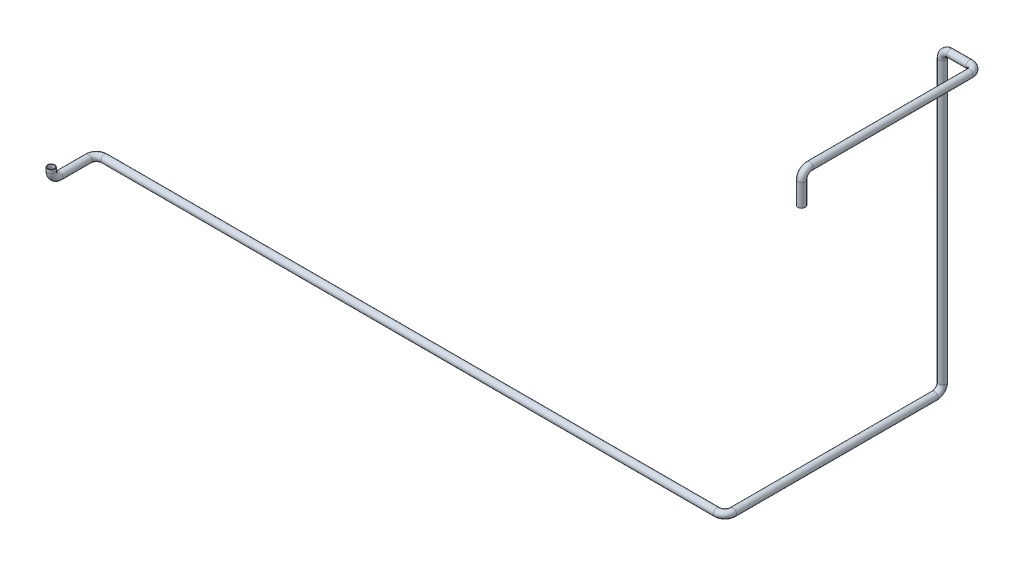
ISO-10303-21;
HEADER;
FILE_DESCRIPTION(('STEP AP214'),'2;1');
FILE_NAME('part.step','',(''),(''),'','','');
FILE_SCHEMA(('AUTOMOTIVE_DESIGN { 1 0 10303 214 1 1 1 1 }'));
ENDSEC;
DATA;
#1=APPLICATION_CONTEXT('core data for automotive mechanical design processes');
#2=APPLICATION_PROTOCOL_DEFINITION('international standard','automotive_design',2000,#1);
#3=PRODUCT_CONTEXT('',#1,'mechanical');
#4=PRODUCT('Part','Part','',(#3));
#5=PRODUCT_RELATED_PRODUCT_CATEGORY('part','',(#4));
#6=PRODUCT_DEFINITION_FORMATION('','',#4);
#7=PRODUCT_DEFINITION_CONTEXT('part definition',#1,'design');
#8=PRODUCT_DEFINITION('design','',#6,#7);
#9=PRODUCT_DEFINITION_SHAPE('','',#8);
#10=(LENGTH_UNIT() NAMED_UNIT(*) SI_UNIT(.MILLI.,.METRE.));
#11=(NAMED_UNIT(*) PLANE_ANGLE_UNIT() SI_UNIT($,.RADIAN.));
#12=(NAMED_UNIT(*) SI_UNIT($,.STERADIAN.) SOLID_ANGLE_UNIT());
#13=UNCERTAINTY_MEASURE_WITH_UNIT(LENGTH_MEASURE(1.E-05),#10,'distance_accuracy_value','');
#14=(GEOMETRIC_REPRESENTATION_CONTEXT(3) GLOBAL_UNCERTAINTY_ASSIGNED_CONTEXT((#13)) GLOBAL_UNIT_ASSIGNED_CONTEXT((#10,
#11,#12)) REPRESENTATION_CONTEXT('',''));
#15=CARTESIAN_POINT('',(0.,0.,0.));
#16=DIRECTION('',(0.,0.,1.));
#17=DIRECTION('',(1.,0.,0.));
#18=AXIS2_PLACEMENT_3D('',#15,#16,#17);
#19=CARTESIAN_POINT('',(0.,-5.,0.));
#20=DIRECTION('',(0.,1.,0.));
#21=DIRECTION('',(0.,0.,1.));
#22=AXIS2_PLACEMENT_3D('',#19,#20,#21);
#23=CYLINDRICAL_SURFACE('',#22,14.5);
#24=CARTESIAN_POINT('',(0.,0.,0.));
#25=DIRECTION('',(0.,1.,0.));
#26=DIRECTION('',(0.,0.,1.));
#27=AXIS2_PLACEMENT_3D('',#24,#25,#26);
#28=CIRCLE('',#27,14.5);
#29=CARTESIAN_POINT('',(0.,0.,14.5));
#30=VERTEX_POINT('',#29);
#31=EDGE_CURVE('E10',#30,#30,#28,.T.);
#32=ORIENTED_EDGE('',*,*,#31,.F.);
#33=EDGE_LOOP('',(#32));
#34=FACE_BOUND('',#33,.T.);
#35=CARTESIAN_POINT('',(0.,-13.,0.));
#36=DIRECTION('',(0.,-1.,0.));
#37=DIRECTION('',(0.,0.,-1.));
#38=AXIS2_PLACEMENT_3D('',#35,#36,#37);
#39=CIRCLE('',#38,14.5);
#40=CARTESIAN_POINT('',(0.,-13.,14.5));
#41=VERTEX_POINT('',#40);
#42=EDGE_CURVE('E130',#41,#41,#39,.T.);
#43=ORIENTED_EDGE('',*,*,#42,.F.);
#44=EDGE_LOOP('',(#43));
#45=FACE_BOUND('',#44,.T.);
#46=ADVANCED_FACE('F33',(#34,#45),#23,.T.);
#47=CARTESIAN_POINT('',(0.,0.,0.));
#48=DIRECTION('',(0.,1.,0.));
#49=DIRECTION('',(0.,0.,1.));
#50=AXIS2_PLACEMENT_3D('',#47,#48,#49);
#51=PLANE('',#50);
#52=CARTESIAN_POINT('',(0.,0.,0.));
#53=DIRECTION('',(0.,1.,0.));
#54=DIRECTION('',(0.,0.,1.));
#55=AXIS2_PLACEMENT_3D('',#52,#53,#54);
#56=CIRCLE('',#55,12.7);
#57=CARTESIAN_POINT('',(0.,0.,12.7));
#58=VERTEX_POINT('',#57);
#59=EDGE_CURVE('E39',#58,#58,#56,.T.);
#60=ORIENTED_EDGE('',*,*,#59,.F.);
#61=EDGE_LOOP('',(#60));
#62=FACE_BOUND('',#61,.T.);
#63=ORIENTED_EDGE('',*,*,#31,.T.);
#64=EDGE_LOOP('',(#63));
#65=FACE_BOUND('',#64,.T.);
#66=ADVANCED_FACE('F249',(#62,#65),#51,.T.);
#67=CARTESIAN_POINT('',(0.,-5.,0.));
#68=DIRECTION('',(0.,1.,0.));
#69=DIRECTION('',(0.,0.,1.));
#70=AXIS2_PLACEMENT_3D('',#67,#68,#69);
#71=CYLINDRICAL_SURFACE('',#70,12.7);
#72=ORIENTED_EDGE('',*,*,#59,.T.);
#73=EDGE_LOOP('',(#72));
#74=FACE_BOUND('',#73,.T.);
#75=CARTESIAN_POINT('',(0.,-13.,0.));
#76=DIRECTION('',(0.,-1.,0.));
#77=DIRECTION('',(0.,0.,-1.));
#78=AXIS2_PLACEMENT_3D('',#75,#76,#77);
#79=CIRCLE('',#78,12.7);
#80=CARTESIAN_POINT('',(0.,-13.,12.7));
#81=VERTEX_POINT('',#80);
#82=EDGE_CURVE('E133',#81,#81,#79,.T.);
#83=ORIENTED_EDGE('',*,*,#82,.T.);
#84=EDGE_LOOP('',(#83));
#85=FACE_BOUND('',#84,.T.);
#86=ADVANCED_FACE('F137',(#74,#85),#71,.F.);
#87=CARTESIAN_POINT('',(2640.,1103.,-345.));
#88=DIRECTION('',(0.,-1.,0.));
#89=DIRECTION('',(0.,0.,-1.));
#90=AXIS2_PLACEMENT_3D('',#87,#88,#89);
#91=CYLINDRICAL_SURFACE('',#90,14.5);
#92=CARTESIAN_POINT('',(2640.,1103.,-345.));
#93=DIRECTION('',(0.,-1.,0.));
#94=DIRECTION('',(-1.,0.,0.));
#95=AXIS2_PLACEMENT_3D('',#92,#93,#94);
#96=CIRCLE('',#95,14.5);
#97=CARTESIAN_POINT('',(2640.,1103.,-330.5));
#98=VERTEX_POINT('',#97);
#99=EDGE_CURVE('E52',#98,#98,#96,.T.);
#100=ORIENTED_EDGE('',*,*,#99,.T.);
#101=EDGE_LOOP('',(#100));
#102=FACE_BOUND('',#101,.T.);
#103=CARTESIAN_POINT('',(2640.,1015.,-345.));
#104=DIRECTION('',(0.,-1.,0.));
#105=DIRECTION('',(-1.,0.,0.));
#106=AXIS2_PLACEMENT_3D('',#103,#104,#105);
#107=CIRCLE('',#106,14.5);
#108=CARTESIAN_POINT('',(2625.5,1015.,-345.));
#109=VERTEX_POINT('',#108);
#110=EDGE_CURVE('E43',#109,#109,#107,.T.);
#111=ORIENTED_EDGE('',*,*,#110,.F.);
#112=EDGE_LOOP('',(#111));
#113=FACE_BOUND('',#112,.T.);
#114=ADVANCED_FACE('F234',(#102,#113),#91,.T.);
#115=CARTESIAN_POINT('',(2640.,1103.,-345.));
#116=DIRECTION('',(0.,-1.,0.));
#117=DIRECTION('',(0.,0.,-1.));
#118=AXIS2_PLACEMENT_3D('',#115,#116,#117);
#119=CYLINDRICAL_SURFACE('',#118,12.7);
#120=CARTESIAN_POINT('',(2640.,1103.,-345.));
#121=DIRECTION('',(0.,-1.,0.));
#122=DIRECTION('',(-1.,0.,0.));
#123=AXIS2_PLACEMENT_3D('',#120,#121,#122);
#124=CIRCLE('',#123,12.7);
#125=CARTESIAN_POINT('',(2640.,1103.,-332.3));
#126=VERTEX_POINT('',#125);
#127=EDGE_CURVE('E55',#126,#126,#124,.T.);
#128=ORIENTED_EDGE('',*,*,#127,.F.);
#129=EDGE_LOOP('',(#128));
#130=FACE_BOUND('',#129,.T.);
#131=CARTESIAN_POINT('',(2640.,1015.,-345.));
#132=DIRECTION('',(0.,-1.,0.));
#133=DIRECTION('',(-1.,0.,0.));
#134=AXIS2_PLACEMENT_3D('',#131,#132,#133);
#135=CIRCLE('',#134,12.7);
#136=CARTESIAN_POINT('',(2627.3,1015.,-345.));
#137=VERTEX_POINT('',#136);
#138=EDGE_CURVE('E47',#137,#137,#135,.T.);
#139=ORIENTED_EDGE('',*,*,#138,.T.);
#140=EDGE_LOOP('',(#139));
#141=FACE_BOUND('',#140,.T.);
#142=ADVANCED_FACE('F231',(#130,#141),#119,.F.);
#143=CARTESIAN_POINT('',(2640.,1103.,-377.));
#144=DIRECTION('',(1.,0.,0.));
#145=DIRECTION('',(0.,0.,-1.));
#146=AXIS2_PLACEMENT_3D('',#143,#144,#145);
#147=TOROIDAL_SURFACE('',#146,31.9999999999998,14.5);
#148=CARTESIAN_POINT('',(2640.,1135.,-377.));
#149=DIRECTION('',(0.,0.,1.));
#150=DIRECTION('',(-1.,0.,0.));
#151=AXIS2_PLACEMENT_3D('',#148,#149,#150);
#152=CIRCLE('',#151,14.5);
#153=CARTESIAN_POINT('',(2640.,1149.5,-377.));
#154=VERTEX_POINT('',#153);
#155=EDGE_CURVE('E58',#154,#154,#152,.T.);
#156=CARTESIAN_POINT('',(2640.,1103.,-377.));
#157=DIRECTION('',(1.,0.,0.));
#158=DIRECTION('',(0.,0.,-1.));
#159=AXIS2_PLACEMENT_3D('',#156,#157,#158);
#160=CIRCLE('',#159,46.4999999999998);
#161=EDGE_CURVE('',#154,#98,#160,.T.);
#162=ORIENTED_EDGE('',*,*,#155,.T.);
#163=ORIENTED_EDGE('',*,*,#99,.F.);
#164=ORIENTED_EDGE('',*,*,#161,.T.);
#165=ORIENTED_EDGE('',*,*,#161,.F.);
#166=EDGE_LOOP('',(#162,#164,#163,#165));
#167=FACE_BOUND('',#166,.T.);
#168=ADVANCED_FACE('F227',(#167),#147,.T.);
#169=CARTESIAN_POINT('',(2640.,1103.,-377.));
#170=DIRECTION('',(1.,0.,0.));
#171=DIRECTION('',(0.,0.,-1.));
#172=AXIS2_PLACEMENT_3D('',#169,#170,#171);
#173=TOROIDAL_SURFACE('',#172,31.9999999999998,12.7);
#174=CARTESIAN_POINT('',(2640.,1135.,-377.));
#175=DIRECTION('',(0.,0.,1.));
#176=DIRECTION('',(-1.,0.,0.));
#177=AXIS2_PLACEMENT_3D('',#174,#175,#176);
#178=CIRCLE('',#177,12.7);
#179=CARTESIAN_POINT('',(2640.,1147.7,-377.));
#180=VERTEX_POINT('',#179);
#181=EDGE_CURVE('E61',#180,#180,#178,.T.);
#182=CARTESIAN_POINT('',(2640.,1103.,-377.));
#183=DIRECTION('',(1.,0.,0.));
#184=DIRECTION('',(0.,0.,-1.));
#185=AXIS2_PLACEMENT_3D('',#182,#183,#184);
#186=CIRCLE('',#185,44.6999999999998);
#187=EDGE_CURVE('',#180,#126,#186,.T.);
#188=ORIENTED_EDGE('',*,*,#181,.F.);
#189=ORIENTED_EDGE('',*,*,#127,.T.);
#190=ORIENTED_EDGE('',*,*,#187,.T.);
#191=ORIENTED_EDGE('',*,*,#187,.F.);
#192=EDGE_LOOP('',(#188,#190,#189,#191));
#193=FACE_BOUND('',#192,.T.);
#194=ADVANCED_FACE('F224',(#193),#173,.F.);
#195=CARTESIAN_POINT('',(2640.,1135.,-1013.));
#196=DIRECTION('',(0.,0.,1.));
#197=DIRECTION('',(1.,0.,0.));
#198=AXIS2_PLACEMENT_3D('',#195,#196,#197);
#199=CYLINDRICAL_SURFACE('',#198,14.5);
#200=CARTESIAN_POINT('',(2640.,1135.,-1013.));
#201=DIRECTION('',(0.,0.,1.));
#202=DIRECTION('',(-1.,0.,0.));
#203=AXIS2_PLACEMENT_3D('',#200,#201,#202);
#204=CIRCLE('',#203,14.5);
#205=CARTESIAN_POINT('',(2654.5,1135.,-1013.));
#206=VERTEX_POINT('',#205);
#207=EDGE_CURVE('E64',#206,#206,#204,.T.);
#208=ORIENTED_EDGE('',*,*,#207,.T.);
#209=EDGE_LOOP('',(#208));
#210=FACE_BOUND('',#209,.T.);
#211=ORIENTED_EDGE('',*,*,#155,.F.);
#212=EDGE_LOOP('',(#211));
#213=FACE_BOUND('',#212,.T.);
#214=ADVANCED_FACE('F220',(#210,#213),#199,.T.);
#215=CARTESIAN_POINT('',(2640.,1135.,-1013.));
#216=DIRECTION('',(0.,0.,1.));
#217=DIRECTION('',(1.,0.,0.));
#218=AXIS2_PLACEMENT_3D('',#215,#216,#217);
#219=CYLINDRICAL_SURFACE('',#218,12.7);
#220=CARTESIAN_POINT('',(2640.,1135.,-1013.));
#221=DIRECTION('',(0.,0.,1.));
#222=DIRECTION('',(-1.,0.,0.));
#223=AXIS2_PLACEMENT_3D('',#220,#221,#222);
#224=CIRCLE('',#223,12.7);
#225=CARTESIAN_POINT('',(2652.7,1135.,-1013.));
#226=VERTEX_POINT('',#225);
#227=EDGE_CURVE('E67',#226,#226,#224,.T.);
#228=ORIENTED_EDGE('',*,*,#227,.F.);
#229=EDGE_LOOP('',(#228));
#230=FACE_BOUND('',#229,.T.);
#231=ORIENTED_EDGE('',*,*,#181,.T.);
#232=EDGE_LOOP('',(#231));
#233=FACE_BOUND('',#232,.T.);
#234=ADVANCED_FACE('F217',(#230,#233),#219,.F.);
#235=CARTESIAN_POINT('',(2608.,1135.,-1013.));
#236=DIRECTION('',(0.,-1.,0.));
#237=DIRECTION('',(0.,0.,-1.));
#238=AXIS2_PLACEMENT_3D('',#235,#236,#237);
#239=TOROIDAL_SURFACE('',#238,31.9999999999998,14.5);
#240=CARTESIAN_POINT('',(2608.,1135.,-1045.));
#241=DIRECTION('',(1.,0.,0.));
#242=DIRECTION('',(0.,0.,1.));
#243=AXIS2_PLACEMENT_3D('',#240,#241,#242);
#244=CIRCLE('',#243,14.5);
#245=CARTESIAN_POINT('',(2608.,1135.,-1059.5));
#246=VERTEX_POINT('',#245);
#247=EDGE_CURVE('E70',#246,#246,#244,.T.);
#248=CARTESIAN_POINT('',(2608.,1135.,-1013.));
#249=DIRECTION('',(0.,-1.,0.));
#250=DIRECTION('',(0.,0.,-1.));
#251=AXIS2_PLACEMENT_3D('',#248,#249,#250);
#252=CIRCLE('',#251,46.4999999999998);
#253=EDGE_CURVE('',#246,#206,#252,.T.);
#254=ORIENTED_EDGE('',*,*,#247,.T.);
#255=ORIENTED_EDGE('',*,*,#207,.F.);
#256=ORIENTED_EDGE('',*,*,#253,.T.);
#257=ORIENTED_EDGE('',*,*,#253,.F.);
#258=EDGE_LOOP('',(#254,#256,#255,#257));
#259=FACE_BOUND('',#258,.T.);
#260=ADVANCED_FACE('F213',(#259),#239,.T.);
#261=CARTESIAN_POINT('',(2608.,1135.,-1013.));
#262=DIRECTION('',(0.,-1.,0.));
#263=DIRECTION('',(0.,0.,-1.));
#264=AXIS2_PLACEMENT_3D('',#261,#262,#263);
#265=TOROIDAL_SURFACE('',#264,31.9999999999998,12.7);
#266=CARTESIAN_POINT('',(2608.,1135.,-1045.));
#267=DIRECTION('',(1.,0.,0.));
#268=DIRECTION('',(0.,0.,1.));
#269=AXIS2_PLACEMENT_3D('',#266,#267,#268);
#270=CIRCLE('',#269,12.7);
#271=CARTESIAN_POINT('',(2608.,1135.,-1057.7));
#272=VERTEX_POINT('',#271);
#273=EDGE_CURVE('E73',#272,#272,#270,.T.);
#274=CARTESIAN_POINT('',(2608.,1135.,-1013.));
#275=DIRECTION('',(0.,-1.,0.));
#276=DIRECTION('',(0.,0.,-1.));
#277=AXIS2_PLACEMENT_3D('',#274,#275,#276);
#278=CIRCLE('',#277,44.6999999999998);
#279=EDGE_CURVE('',#272,#226,#278,.T.);
#280=ORIENTED_EDGE('',*,*,#273,.F.);
#281=ORIENTED_EDGE('',*,*,#227,.T.);
#282=ORIENTED_EDGE('',*,*,#279,.T.);
#283=ORIENTED_EDGE('',*,*,#279,.F.);
#284=EDGE_LOOP('',(#280,#282,#281,#283));
#285=FACE_BOUND('',#284,.T.);
#286=ADVANCED_FACE('F210',(#285),#265,.F.);
#287=CARTESIAN_POINT('',(2532.,1135.,-1045.));
#288=DIRECTION('',(1.,0.,0.));
#289=DIRECTION('',(0.,0.,-1.));
#290=AXIS2_PLACEMENT_3D('',#287,#288,#289);
#291=CYLINDRICAL_SURFACE('',#290,14.5);
#292=CARTESIAN_POINT('',(2532.,1135.,-1045.));
#293=DIRECTION('',(1.,0.,0.));
#294=DIRECTION('',(0.,0.,1.));
#295=AXIS2_PLACEMENT_3D('',#292,#293,#294);
#296=CIRCLE('',#295,14.5);
#297=CARTESIAN_POINT('',(2532.,1149.5,-1045.));
#298=VERTEX_POINT('',#297);
#299=EDGE_CURVE('E76',#298,#298,#296,.T.);
#300=ORIENTED_EDGE('',*,*,#299,.T.);
#301=EDGE_LOOP('',(#300));
#302=FACE_BOUND('',#301,.T.);
#303=ORIENTED_EDGE('',*,*,#247,.F.);
#304=EDGE_LOOP('',(#303));
#305=FACE_BOUND('',#304,.T.);
#306=ADVANCED_FACE('F206',(#302,#305),#291,.T.);
#307=CARTESIAN_POINT('',(2532.,1135.,-1045.));
#308=DIRECTION('',(1.,0.,0.));
#309=DIRECTION('',(0.,0.,-1.));
#310=AXIS2_PLACEMENT_3D('',#307,#308,#309);
#311=CYLINDRICAL_SURFACE('',#310,12.7);
#312=CARTESIAN_POINT('',(2532.,1135.,-1045.));
#313=DIRECTION('',(1.,0.,0.));
#314=DIRECTION('',(0.,0.,1.));
#315=AXIS2_PLACEMENT_3D('',#312,#313,#314);
#316=CIRCLE('',#315,12.7);
#317=CARTESIAN_POINT('',(2532.,1147.7,-1045.));
#318=VERTEX_POINT('',#317);
#319=EDGE_CURVE('E79',#318,#318,#316,.T.);
#320=ORIENTED_EDGE('',*,*,#319,.F.);
#321=EDGE_LOOP('',(#320));
#322=FACE_BOUND('',#321,.T.);
#323=ORIENTED_EDGE('',*,*,#273,.T.);
#324=EDGE_LOOP('',(#323));
#325=FACE_BOUND('',#324,.T.);
#326=ADVANCED_FACE('F203',(#322,#325),#311,.F.);
#327=CARTESIAN_POINT('',(2532.,1103.,-1045.));
#328=DIRECTION('',(0.,0.,-1.));
#329=DIRECTION('',(-1.,0.,0.));
#330=AXIS2_PLACEMENT_3D('',#327,#328,#329);
#331=TOROIDAL_SURFACE('',#330,32.,14.5);
#332=CARTESIAN_POINT('',(2500.,1103.,-1045.));
#333=DIRECTION('',(0.,1.,0.));
#334=DIRECTION('',(0.,0.,1.));
#335=AXIS2_PLACEMENT_3D('',#332,#333,#334);
#336=CIRCLE('',#335,14.5);
#337=CARTESIAN_POINT('',(2485.5,1103.,-1045.));
#338=VERTEX_POINT('',#337);
#339=EDGE_CURVE('E82',#338,#338,#336,.T.);
#340=CARTESIAN_POINT('',(2532.,1103.,-1045.));
#341=DIRECTION('',(0.,0.,-1.));
#342=DIRECTION('',(-1.,0.,0.));
#343=AXIS2_PLACEMENT_3D('',#340,#341,#342);
#344=CIRCLE('',#343,46.5);
#345=EDGE_CURVE('',#338,#298,#344,.T.);
#346=ORIENTED_EDGE('',*,*,#339,.T.);
#347=ORIENTED_EDGE('',*,*,#299,.F.);
#348=ORIENTED_EDGE('',*,*,#345,.T.);
#349=ORIENTED_EDGE('',*,*,#345,.F.);
#350=EDGE_LOOP('',(#346,#348,#347,#349));
#351=FACE_BOUND('',#350,.T.);
#352=ADVANCED_FACE('F199',(#351),#331,.T.);
#353=CARTESIAN_POINT('',(2532.,1103.,-1045.));
#354=DIRECTION('',(0.,0.,-1.));
#355=DIRECTION('',(-1.,0.,0.));
#356=AXIS2_PLACEMENT_3D('',#353,#354,#355);
#357=TOROIDAL_SURFACE('',#356,32.,12.7);
#358=CARTESIAN_POINT('',(2500.,1103.,-1045.));
#359=DIRECTION('',(0.,1.,0.));
#360=DIRECTION('',(0.,0.,1.));
#361=AXIS2_PLACEMENT_3D('',#358,#359,#360);
#362=CIRCLE('',#361,12.7);
#363=CARTESIAN_POINT('',(2487.3,1103.,-1045.));
#364=VERTEX_POINT('',#363);
#365=EDGE_CURVE('E85',#364,#364,#362,.T.);
#366=CARTESIAN_POINT('',(2532.,1103.,-1045.));
#367=DIRECTION('',(0.,0.,-1.));
#368=DIRECTION('',(-1.,0.,0.));
#369=AXIS2_PLACEMENT_3D('',#366,#367,#368);
#370=CIRCLE('',#369,44.7);
#371=EDGE_CURVE('',#364,#318,#370,.T.);
#372=ORIENTED_EDGE('',*,*,#365,.F.);
#373=ORIENTED_EDGE('',*,*,#319,.T.);
#374=ORIENTED_EDGE('',*,*,#371,.T.);
#375=ORIENTED_EDGE('',*,*,#371,.F.);
#376=EDGE_LOOP('',(#372,#374,#373,#375));
#377=FACE_BOUND('',#376,.T.);
#378=ADVANCED_FACE('F196',(#377),#357,.F.);
#379=CARTESIAN_POINT('',(2500.,-13.0000000000001,-1045.));
#380=DIRECTION('',(0.,1.,0.));
#381=DIRECTION('',(0.,0.,1.));
#382=AXIS2_PLACEMENT_3D('',#379,#380,#381);
#383=CYLINDRICAL_SURFACE('',#382,14.5);
#384=CARTESIAN_POINT('',(2500.,-13.0000000000001,-1045.));
#385=DIRECTION('',(0.,1.,0.));
#386=DIRECTION('',(0.,0.,1.));
#387=AXIS2_PLACEMENT_3D('',#384,#385,#386);
#388=CIRCLE('',#387,14.5);
#389=CARTESIAN_POINT('',(2500.,-13.0000000000002,-1059.5));
#390=VERTEX_POINT('',#389);
#391=EDGE_CURVE('E88',#390,#390,#388,.T.);
#392=ORIENTED_EDGE('',*,*,#391,.T.);
#393=EDGE_LOOP('',(#392));
#394=FACE_BOUND('',#393,.T.);
#395=ORIENTED_EDGE('',*,*,#339,.F.);
#396=EDGE_LOOP('',(#395));
#397=FACE_BOUND('',#396,.T.);
#398=ADVANCED_FACE('F192',(#394,#397),#383,.T.);
#399=CARTESIAN_POINT('',(2500.,-13.0000000000001,-1045.));
#400=DIRECTION('',(0.,1.,0.));
#401=DIRECTION('',(0.,0.,1.));
#402=AXIS2_PLACEMENT_3D('',#399,#400,#401);
#403=CYLINDRICAL_SURFACE('',#402,12.7);
#404=CARTESIAN_POINT('',(2500.,-13.0000000000001,-1045.));
#405=DIRECTION('',(0.,1.,0.));
#406=DIRECTION('',(0.,0.,1.));
#407=AXIS2_PLACEMENT_3D('',#404,#405,#406);
#408=CIRCLE('',#407,12.7);
#409=CARTESIAN_POINT('',(2500.,-13.0000000000002,-1057.7));
#410=VERTEX_POINT('',#409);
#411=EDGE_CURVE('E91',#410,#410,#408,.T.);
#412=ORIENTED_EDGE('',*,*,#411,.F.);
#413=EDGE_LOOP('',(#412));
#414=FACE_BOUND('',#413,.T.);
#415=ORIENTED_EDGE('',*,*,#365,.T.);
#416=EDGE_LOOP('',(#415));
#417=FACE_BOUND('',#416,.T.);
#418=ADVANCED_FACE('F189',(#414,#417),#403,.F.);
#419=CARTESIAN_POINT('',(2500.,-13.,-1013.));
#420=DIRECTION('',(1.,0.,0.));
#421=DIRECTION('',(0.,0.,-1.));
#422=AXIS2_PLACEMENT_3D('',#419,#420,#421);
#423=TOROIDAL_SURFACE('',#422,32.,14.5);
#424=CARTESIAN_POINT('',(2500.,-45.,-1013.));
#425=DIRECTION('',(0.,0.,-1.));
#426=DIRECTION('',(0.,1.,0.));
#427=AXIS2_PLACEMENT_3D('',#424,#425,#426);
#428=CIRCLE('',#427,14.5);
#429=CARTESIAN_POINT('',(2500.,-59.5,-1013.));
#430=VERTEX_POINT('',#429);
#431=EDGE_CURVE('E94',#430,#430,#428,.T.);
#432=CARTESIAN_POINT('',(2500.,-13.,-1013.));
#433=DIRECTION('',(1.,0.,0.));
#434=DIRECTION('',(0.,0.,-1.));
#435=AXIS2_PLACEMENT_3D('',#432,#433,#434);
#436=CIRCLE('',#435,46.5);
#437=EDGE_CURVE('',#430,#390,#436,.T.);
#438=ORIENTED_EDGE('',*,*,#431,.T.);
#439=ORIENTED_EDGE('',*,*,#391,.F.);
#440=ORIENTED_EDGE('',*,*,#437,.T.);
#441=ORIENTED_EDGE('',*,*,#437,.F.);
#442=EDGE_LOOP('',(#438,#440,#439,#441));
#443=FACE_BOUND('',#442,.T.);
#444=ADVANCED_FACE('F185',(#443),#423,.T.);
#445=CARTESIAN_POINT('',(2500.,-13.,-1013.));
#446=DIRECTION('',(1.,0.,0.));
#447=DIRECTION('',(0.,0.,-1.));
#448=AXIS2_PLACEMENT_3D('',#445,#446,#447);
#449=TOROIDAL_SURFACE('',#448,32.,12.7);
#450=CARTESIAN_POINT('',(2500.,-45.,-1013.));
#451=DIRECTION('',(0.,0.,-1.));
#452=DIRECTION('',(0.,1.,0.));
#453=AXIS2_PLACEMENT_3D('',#450,#451,#452);
#454=CIRCLE('',#453,12.7);
#455=CARTESIAN_POINT('',(2500.,-57.7,-1013.));
#456=VERTEX_POINT('',#455);
#457=EDGE_CURVE('E97',#456,#456,#454,.T.);
#458=CARTESIAN_POINT('',(2500.,-13.,-1013.));
#459=DIRECTION('',(1.,0.,0.));
#460=DIRECTION('',(0.,0.,-1.));
#461=AXIS2_PLACEMENT_3D('',#458,#459,#460);
#462=CIRCLE('',#461,44.7);
#463=EDGE_CURVE('',#456,#410,#462,.T.);
#464=ORIENTED_EDGE('',*,*,#457,.F.);
#465=ORIENTED_EDGE('',*,*,#411,.T.);
#466=ORIENTED_EDGE('',*,*,#463,.T.);
#467=ORIENTED_EDGE('',*,*,#463,.F.);
#468=EDGE_LOOP('',(#464,#466,#465,#467));
#469=FACE_BOUND('',#468,.T.);
#470=ADVANCED_FACE('F182',(#469),#449,.F.);
#471=CARTESIAN_POINT('',(2500.,-45.,-212.));
#472=DIRECTION('',(0.,0.,-1.));
#473=DIRECTION('',(-1.,0.,0.));
#474=AXIS2_PLACEMENT_3D('',#471,#472,#473);
#475=CYLINDRICAL_SURFACE('',#474,14.5);
#476=CARTESIAN_POINT('',(2500.,-45.,-212.));
#477=DIRECTION('',(0.,0.,-1.));
#478=DIRECTION('',(0.,1.,0.));
#479=AXIS2_PLACEMENT_3D('',#476,#477,#478);
#480=CIRCLE('',#479,14.5);
#481=CARTESIAN_POINT('',(2514.5,-45.,-212.));
#482=VERTEX_POINT('',#481);
#483=EDGE_CURVE('E100',#482,#482,#480,.T.);
#484=ORIENTED_EDGE('',*,*,#483,.T.);
#485=EDGE_LOOP('',(#484));
#486=FACE_BOUND('',#485,.T.);
#487=ORIENTED_EDGE('',*,*,#431,.F.);
#488=EDGE_LOOP('',(#487));
#489=FACE_BOUND('',#488,.T.);
#490=ADVANCED_FACE('F178',(#486,#489),#475,.T.);
#491=CARTESIAN_POINT('',(2500.,-45.,-212.));
#492=DIRECTION('',(0.,0.,-1.));
#493=DIRECTION('',(-1.,0.,0.));
#494=AXIS2_PLACEMENT_3D('',#491,#492,#493);
#495=CYLINDRICAL_SURFACE('',#494,12.7);
#496=CARTESIAN_POINT('',(2500.,-45.,-212.));
#497=DIRECTION('',(0.,0.,-1.));
#498=DIRECTION('',(0.,1.,0.));
#499=AXIS2_PLACEMENT_3D('',#496,#497,#498);
#500=CIRCLE('',#499,12.7);
#501=CARTESIAN_POINT('',(2512.7,-45.,-212.));
#502=VERTEX_POINT('',#501);
#503=EDGE_CURVE('E103',#502,#502,#500,.T.);
#504=ORIENTED_EDGE('',*,*,#503,.F.);
#505=EDGE_LOOP('',(#504));
#506=FACE_BOUND('',#505,.T.);
#507=ORIENTED_EDGE('',*,*,#457,.T.);
#508=EDGE_LOOP('',(#507));
#509=FACE_BOUND('',#508,.T.);
#510=ADVANCED_FACE('F175',(#506,#509),#495,.F.);
#511=CARTESIAN_POINT('',(2468.,-45.,-212.));
#512=DIRECTION('',(0.,1.,0.));
#513=DIRECTION('',(0.,0.,1.));
#514=AXIS2_PLACEMENT_3D('',#511,#512,#513);
#515=TOROIDAL_SURFACE('',#514,32.,14.5);
#516=CARTESIAN_POINT('',(2468.,-45.,-180.));
#517=DIRECTION('',(1.,0.,0.));
#518=DIRECTION('',(0.,1.,0.));
#519=AXIS2_PLACEMENT_3D('',#516,#517,#518);
#520=CIRCLE('',#519,14.5);
#521=CARTESIAN_POINT('',(2468.,-45.,-165.5));
#522=VERTEX_POINT('',#521);
#523=EDGE_CURVE('E106',#522,#522,#520,.T.);
#524=CARTESIAN_POINT('',(2468.,-45.,-212.));
#525=DIRECTION('',(0.,1.,0.));
#526=DIRECTION('',(0.,0.,1.));
#527=AXIS2_PLACEMENT_3D('',#524,#525,#526);
#528=CIRCLE('',#527,46.5);
#529=EDGE_CURVE('',#522,#482,#528,.T.);
#530=ORIENTED_EDGE('',*,*,#523,.T.);
#531=ORIENTED_EDGE('',*,*,#483,.F.);
#532=ORIENTED_EDGE('',*,*,#529,.T.);
#533=ORIENTED_EDGE('',*,*,#529,.F.);
#534=EDGE_LOOP('',(#530,#532,#531,#533));
#535=FACE_BOUND('',#534,.T.);
#536=ADVANCED_FACE('F171',(#535),#515,.T.);
#537=CARTESIAN_POINT('',(2468.,-45.,-212.));
#538=DIRECTION('',(0.,1.,0.));
#539=DIRECTION('',(0.,0.,1.));
#540=AXIS2_PLACEMENT_3D('',#537,#538,#539);
#541=TOROIDAL_SURFACE('',#540,32.,12.7);
#542=CARTESIAN_POINT('',(2468.,-45.,-180.));
#543=DIRECTION('',(1.,0.,0.));
#544=DIRECTION('',(0.,1.,0.));
#545=AXIS2_PLACEMENT_3D('',#542,#543,#544);
#546=CIRCLE('',#545,12.7);
#547=CARTESIAN_POINT('',(2468.,-45.,-167.3));
#548=VERTEX_POINT('',#547);
#549=EDGE_CURVE('E109',#548,#548,#546,.T.);
#550=CARTESIAN_POINT('',(2468.,-45.,-212.));
#551=DIRECTION('',(0.,1.,0.));
#552=DIRECTION('',(0.,0.,1.));
#553=AXIS2_PLACEMENT_3D('',#550,#551,#552);
#554=CIRCLE('',#553,44.7);
#555=EDGE_CURVE('',#548,#502,#554,.T.);
#556=ORIENTED_EDGE('',*,*,#549,.F.);
#557=ORIENTED_EDGE('',*,*,#503,.T.);
#558=ORIENTED_EDGE('',*,*,#555,.T.);
#559=ORIENTED_EDGE('',*,*,#555,.F.);
#560=EDGE_LOOP('',(#556,#558,#557,#559));
#561=FACE_BOUND('',#560,.T.);
#562=ADVANCED_FACE('F168',(#561),#541,.F.);
#563=CARTESIAN_POINT('',(32.,-45.,-180.));
#564=DIRECTION('',(1.,0.,0.));
#565=DIRECTION('',(0.,0.,-1.));
#566=AXIS2_PLACEMENT_3D('',#563,#564,#565);
#567=CYLINDRICAL_SURFACE('',#566,14.5);
#568=CARTESIAN_POINT('',(32.,-45.,-180.));
#569=DIRECTION('',(1.,0.,0.));
#570=DIRECTION('',(0.,1.,0.));
#571=AXIS2_PLACEMENT_3D('',#568,#569,#570);
#572=CIRCLE('',#571,14.5);
#573=CARTESIAN_POINT('',(32.,-45.,-194.5));
#574=VERTEX_POINT('',#573);
#575=EDGE_CURVE('E112',#574,#574,#572,.T.);
#576=ORIENTED_EDGE('',*,*,#575,.T.);
#577=EDGE_LOOP('',(#576));
#578=FACE_BOUND('',#577,.T.);
#579=ORIENTED_EDGE('',*,*,#523,.F.);
#580=EDGE_LOOP('',(#579));
#581=FACE_BOUND('',#580,.T.);
#582=ADVANCED_FACE('F164',(#578,#581),#567,.T.);
#583=CARTESIAN_POINT('',(32.,-45.,-180.));
#584=DIRECTION('',(1.,0.,0.));
#585=DIRECTION('',(0.,0.,-1.));
#586=AXIS2_PLACEMENT_3D('',#583,#584,#585);
#587=CYLINDRICAL_SURFACE('',#586,12.7);
#588=CARTESIAN_POINT('',(32.,-45.,-180.));
#589=DIRECTION('',(1.,0.,0.));
#590=DIRECTION('',(0.,1.,0.));
#591=AXIS2_PLACEMENT_3D('',#588,#589,#590);
#592=CIRCLE('',#591,12.7);
#593=CARTESIAN_POINT('',(32.,-45.,-192.7));
#594=VERTEX_POINT('',#593);
#595=EDGE_CURVE('E115',#594,#594,#592,.T.);
#596=ORIENTED_EDGE('',*,*,#595,.F.);
#597=EDGE_LOOP('',(#596));
#598=FACE_BOUND('',#597,.T.);
#599=ORIENTED_EDGE('',*,*,#549,.T.);
#600=EDGE_LOOP('',(#599));
#601=FACE_BOUND('',#600,.T.);
#602=ADVANCED_FACE('F161',(#598,#601),#587,.F.);
#603=CARTESIAN_POINT('',(32.,-45.,-148.));
#604=DIRECTION('',(0.,-1.,0.));
#605=DIRECTION('',(0.,0.,-1.));
#606=AXIS2_PLACEMENT_3D('',#603,#604,#605);
#607=TOROIDAL_SURFACE('',#606,32.,14.5);
#608=CARTESIAN_POINT('',(0.,-45.,-148.));
#609=DIRECTION('',(0.,0.,-1.));
#610=DIRECTION('',(0.,1.,0.));
#611=AXIS2_PLACEMENT_3D('',#608,#609,#610);
#612=CIRCLE('',#611,14.5);
#613=CARTESIAN_POINT('',(-14.5,-45.,-148.));
#614=VERTEX_POINT('',#613);
#615=EDGE_CURVE('E118',#614,#614,#612,.T.);
#616=CARTESIAN_POINT('',(32.,-45.,-148.));
#617=DIRECTION('',(0.,-1.,0.));
#618=DIRECTION('',(0.,0.,-1.));
#619=AXIS2_PLACEMENT_3D('',#616,#617,#618);
#620=CIRCLE('',#619,46.5);
#621=EDGE_CURVE('',#614,#574,#620,.T.);
#622=ORIENTED_EDGE('',*,*,#615,.T.);
#623=ORIENTED_EDGE('',*,*,#575,.F.);
#624=ORIENTED_EDGE('',*,*,#621,.T.);
#625=ORIENTED_EDGE('',*,*,#621,.F.);
#626=EDGE_LOOP('',(#622,#624,#623,#625));
#627=FACE_BOUND('',#626,.T.);
#628=ADVANCED_FACE('F157',(#627),#607,.T.);
#629=CARTESIAN_POINT('',(32.,-45.,-148.));
#630=DIRECTION('',(0.,-1.,0.));
#631=DIRECTION('',(0.,0.,-1.));
#632=AXIS2_PLACEMENT_3D('',#629,#630,#631);
#633=TOROIDAL_SURFACE('',#632,32.,12.7);
#634=CARTESIAN_POINT('',(0.,-45.,-148.));
#635=DIRECTION('',(0.,0.,-1.));
#636=DIRECTION('',(0.,1.,0.));
#637=AXIS2_PLACEMENT_3D('',#634,#635,#636);
#638=CIRCLE('',#637,12.7);
#639=CARTESIAN_POINT('',(-12.7,-45.,-148.));
#640=VERTEX_POINT('',#639);
#641=EDGE_CURVE('E121',#640,#640,#638,.T.);
#642=CARTESIAN_POINT('',(32.,-45.,-148.));
#643=DIRECTION('',(0.,-1.,0.));
#644=DIRECTION('',(0.,0.,-1.));
#645=AXIS2_PLACEMENT_3D('',#642,#643,#644);
#646=CIRCLE('',#645,44.7);
#647=EDGE_CURVE('',#640,#594,#646,.T.);
#648=ORIENTED_EDGE('',*,*,#641,.F.);
#649=ORIENTED_EDGE('',*,*,#595,.T.);
#650=ORIENTED_EDGE('',*,*,#647,.T.);
#651=ORIENTED_EDGE('',*,*,#647,.F.);
#652=EDGE_LOOP('',(#648,#650,#649,#651));
#653=FACE_BOUND('',#652,.T.);
#654=ADVANCED_FACE('F154',(#653),#633,.F.);
#655=CARTESIAN_POINT('',(0.,-45.,-32.));
#656=DIRECTION('',(0.,0.,-1.));
#657=DIRECTION('',(-1.,0.,0.));
#658=AXIS2_PLACEMENT_3D('',#655,#656,#657);
#659=CYLINDRICAL_SURFACE('',#658,14.5);
#660=CARTESIAN_POINT('',(0.,-45.,-32.));
#661=DIRECTION('',(0.,0.,-1.));
#662=DIRECTION('',(0.,1.,0.));
#663=AXIS2_PLACEMENT_3D('',#660,#661,#662);
#664=CIRCLE('',#663,14.5);
#665=CARTESIAN_POINT('',(0.,-59.5,-32.));
#666=VERTEX_POINT('',#665);
#667=EDGE_CURVE('E124',#666,#666,#664,.T.);
#668=ORIENTED_EDGE('',*,*,#667,.T.);
#669=EDGE_LOOP('',(#668));
#670=FACE_BOUND('',#669,.T.);
#671=ORIENTED_EDGE('',*,*,#615,.F.);
#672=EDGE_LOOP('',(#671));
#673=FACE_BOUND('',#672,.T.);
#674=ADVANCED_FACE('F150',(#670,#673),#659,.T.);
#675=CARTESIAN_POINT('',(0.,-45.,-32.));
#676=DIRECTION('',(0.,0.,-1.));
#677=DIRECTION('',(-1.,0.,0.));
#678=AXIS2_PLACEMENT_3D('',#675,#676,#677);
#679=CYLINDRICAL_SURFACE('',#678,12.7);
#680=CARTESIAN_POINT('',(0.,-45.,-32.));
#681=DIRECTION('',(0.,0.,-1.));
#682=DIRECTION('',(0.,1.,0.));
#683=AXIS2_PLACEMENT_3D('',#680,#681,#682);
#684=CIRCLE('',#683,12.7);
#685=CARTESIAN_POINT('',(0.,-57.7,-32.));
#686=VERTEX_POINT('',#685);
#687=EDGE_CURVE('E127',#686,#686,#684,.T.);
#688=ORIENTED_EDGE('',*,*,#687,.F.);
#689=EDGE_LOOP('',(#688));
#690=FACE_BOUND('',#689,.T.);
#691=ORIENTED_EDGE('',*,*,#641,.T.);
#692=EDGE_LOOP('',(#691));
#693=FACE_BOUND('',#692,.T.);
#694=ADVANCED_FACE('F147',(#690,#693),#679,.F.);
#695=CARTESIAN_POINT('',(0.,-13.,-32.));
#696=DIRECTION('',(1.,0.,0.));
#697=DIRECTION('',(0.,0.,-1.));
#698=AXIS2_PLACEMENT_3D('',#695,#696,#697);
#699=TOROIDAL_SURFACE('',#698,32.,14.5);
#700=CARTESIAN_POINT('',(0.,-13.,-32.));
#701=DIRECTION('',(1.,0.,0.));
#702=DIRECTION('',(0.,0.,-1.));
#703=AXIS2_PLACEMENT_3D('',#700,#701,#702);
#704=CIRCLE('',#703,46.5);
#705=EDGE_CURVE('',#41,#666,#704,.T.);
#706=ORIENTED_EDGE('',*,*,#42,.T.);
#707=ORIENTED_EDGE('',*,*,#667,.F.);
#708=ORIENTED_EDGE('',*,*,#705,.T.);
#709=ORIENTED_EDGE('',*,*,#705,.F.);
#710=EDGE_LOOP('',(#706,#708,#707,#709));
#711=FACE_BOUND('',#710,.T.);
#712=ADVANCED_FACE('F143',(#711),#699,.T.);
#713=CARTESIAN_POINT('',(0.,-13.,-32.));
#714=DIRECTION('',(1.,0.,0.));
#715=DIRECTION('',(0.,0.,-1.));
#716=AXIS2_PLACEMENT_3D('',#713,#714,#715);
#717=TOROIDAL_SURFACE('',#716,32.,12.7);
#718=CARTESIAN_POINT('',(0.,-13.,-32.));
#719=DIRECTION('',(1.,0.,0.));
#720=DIRECTION('',(0.,0.,-1.));
#721=AXIS2_PLACEMENT_3D('',#718,#719,#720);
#722=CIRCLE('',#721,44.7);
#723=EDGE_CURVE('',#81,#686,#722,.T.);
#724=ORIENTED_EDGE('',*,*,#82,.F.);
#725=ORIENTED_EDGE('',*,*,#687,.T.);
#726=ORIENTED_EDGE('',*,*,#723,.T.);
#727=ORIENTED_EDGE('',*,*,#723,.F.);
#728=EDGE_LOOP('',(#724,#726,#725,#727));
#729=FACE_BOUND('',#728,.T.);
#730=ADVANCED_FACE('F139',(#729),#717,.F.);
#731=CARTESIAN_POINT('',(2640.,1015.,-345.));
#732=DIRECTION('',(0.,-1.,0.));
#733=DIRECTION('',(-1.,0.,0.));
#734=AXIS2_PLACEMENT_3D('',#731,#732,#733);
#735=PLANE('',#734);
#736=ORIENTED_EDGE('',*,*,#138,.F.);
#737=EDGE_LOOP('',(#736));
#738=FACE_BOUND('',#737,.T.);
#739=ORIENTED_EDGE('',*,*,#110,.T.);
#740=EDGE_LOOP('',(#739));
#741=FACE_BOUND('',#740,.T.);
#742=ADVANCED_FACE('F142',(#738,#741),#735,.T.);
#743=CLOSED_SHELL('',(#46,#66,#86,#114,#142,#168,#194,#214,#234,#260,#286,#306,#326,#352,#378,
#398,#418,#444,#470,#490,#510,#536,#562,#582,#602,#628,#654,#674,#694,#712,#730,#742));
#744=MANIFOLD_SOLID_BREP('B2',#743);
#745=ADVANCED_BREP_SHAPE_REPRESENTATION('',(#18,#744),#14);
#746=SHAPE_DEFINITION_REPRESENTATION(#9,#745);
ENDSEC;
END-ISO-10303-21;
